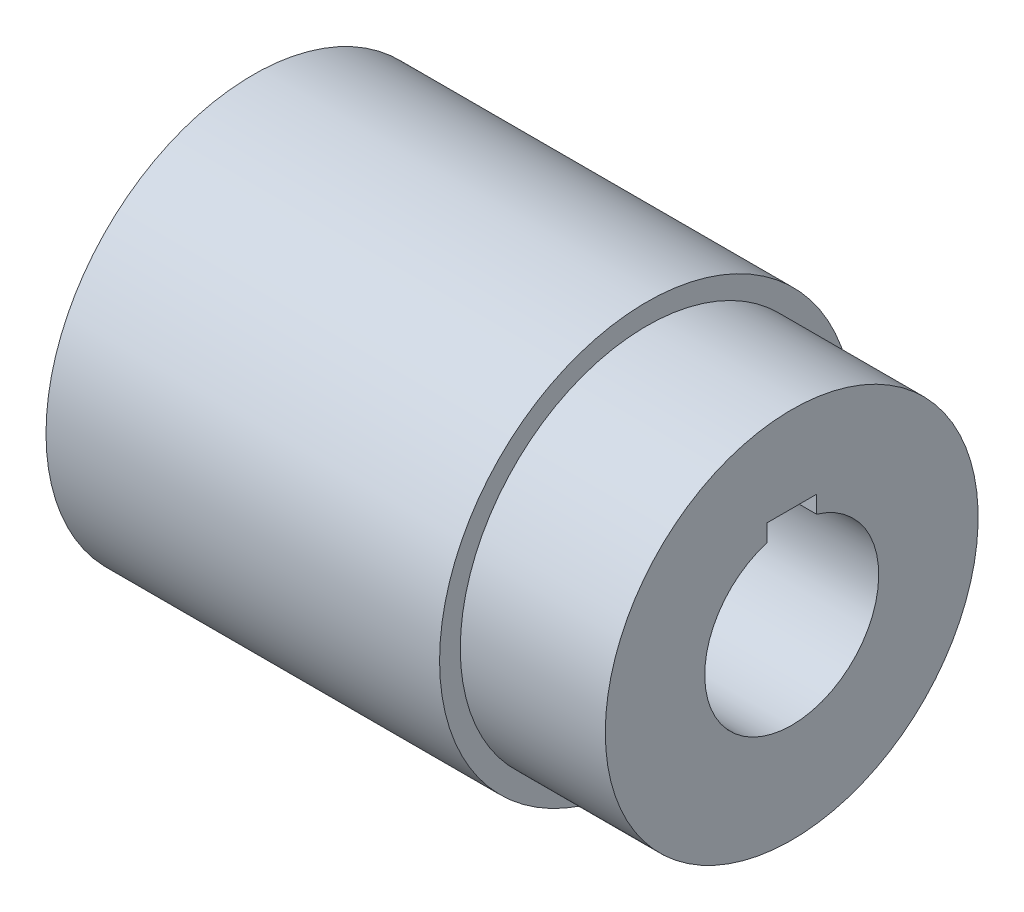
ISO-10303-21;
HEADER;
FILE_DESCRIPTION(('STEP AP214'),'2;1');
FILE_NAME('part.step','',(''),(''),'','','');
FILE_SCHEMA(('AUTOMOTIVE_DESIGN { 1 0 10303 214 1 1 1 1 }'));
ENDSEC;
DATA;
#1=APPLICATION_CONTEXT('core data for automotive mechanical design processes');
#2=APPLICATION_PROTOCOL_DEFINITION('international standard','automotive_design',2000,#1);
#3=PRODUCT_CONTEXT('',#1,'mechanical');
#4=PRODUCT('Part','Part','',(#3));
#5=PRODUCT_RELATED_PRODUCT_CATEGORY('part','',(#4));
#6=PRODUCT_DEFINITION_FORMATION('','',#4);
#7=PRODUCT_DEFINITION_CONTEXT('part definition',#1,'design');
#8=PRODUCT_DEFINITION('design','',#6,#7);
#9=PRODUCT_DEFINITION_SHAPE('','',#8);
#10=(LENGTH_UNIT() NAMED_UNIT(*) SI_UNIT(.MILLI.,.METRE.));
#11=(NAMED_UNIT(*) PLANE_ANGLE_UNIT() SI_UNIT($,.RADIAN.));
#12=(NAMED_UNIT(*) SI_UNIT($,.STERADIAN.) SOLID_ANGLE_UNIT());
#13=UNCERTAINTY_MEASURE_WITH_UNIT(LENGTH_MEASURE(1.E-05),#10,'distance_accuracy_value','');
#14=(GEOMETRIC_REPRESENTATION_CONTEXT(3) GLOBAL_UNCERTAINTY_ASSIGNED_CONTEXT((#13)) GLOBAL_UNIT_ASSIGNED_CONTEXT((#10,
#11,#12)) REPRESENTATION_CONTEXT('',''));
#15=CARTESIAN_POINT('',(0.,0.,0.));
#16=DIRECTION('',(0.,0.,1.));
#17=DIRECTION('',(1.,0.,0.));
#18=AXIS2_PLACEMENT_3D('',#15,#16,#17);
#19=CARTESIAN_POINT('',(130.,0.,0.));
#20=DIRECTION('',(-1.,0.,0.));
#21=DIRECTION('',(0.,0.,1.));
#22=AXIS2_PLACEMENT_3D('',#19,#20,#21);
#23=CYLINDRICAL_SURFACE('',#22,21.);
#24=DIRECTION('',(-1.,0.,0.));
#25=VECTOR('',#24,1.);
#26=CARTESIAN_POINT('',(130.,20.1246117974981,-5.99999999999999));
#27=LINE('',#26,#25);
#28=CARTESIAN_POINT('',(20.,20.1246117974981,-5.99999999999999));
#29=VERTEX_POINT('',#28);
#30=CARTESIAN_POINT('',(130.,20.1246117974981,-5.99999999999999));
#31=VERTEX_POINT('',#30);
#32=EDGE_CURVE('E60',#29,#31,#27,.F.);
#33=ORIENTED_EDGE('',*,*,#32,.F.);
#34=CARTESIAN_POINT('',(20.,0.,0.));
#35=DIRECTION('',(-1.,0.,0.));
#36=DIRECTION('',(0.,0.,1.));
#37=AXIS2_PLACEMENT_3D('',#34,#35,#36);
#38=CIRCLE('',#37,21.);
#39=CARTESIAN_POINT('',(20.,20.1246117974981,6.00000000000001));
#40=VERTEX_POINT('',#39);
#41=EDGE_CURVE('E53',#29,#40,#38,.T.);
#42=ORIENTED_EDGE('',*,*,#41,.T.);
#43=DIRECTION('',(-1.,0.,0.));
#44=VECTOR('',#43,1.);
#45=CARTESIAN_POINT('',(130.,20.1246117974981,6.00000000000001));
#46=LINE('',#45,#44);
#47=CARTESIAN_POINT('',(130.,20.1246117974981,6.00000000000001));
#48=VERTEX_POINT('',#47);
#49=EDGE_CURVE('E47',#48,#40,#46,.T.);
#50=ORIENTED_EDGE('',*,*,#49,.F.);
#51=CARTESIAN_POINT('',(130.,0.,0.));
#52=DIRECTION('',(1.,0.,0.));
#53=DIRECTION('',(0.,0.,-1.));
#54=AXIS2_PLACEMENT_3D('',#51,#52,#53);
#55=CIRCLE('',#54,21.);
#56=EDGE_CURVE('E142',#48,#31,#55,.T.);
#57=ORIENTED_EDGE('',*,*,#56,.T.);
#58=EDGE_LOOP('',(#33,#42,#50,#57));
#59=FACE_BOUND('',#58,.T.);
#60=ADVANCED_FACE('F39',(#59),#23,.F.);
#61=CARTESIAN_POINT('',(130.,24.3,-5.99999999999999));
#62=DIRECTION('',(0.,1.,0.));
#63=DIRECTION('',(0.,0.,1.));
#64=AXIS2_PLACEMENT_3D('',#61,#62,#63);
#65=PLANE('',#64);
#66=DIRECTION('',(0.,0.,1.));
#67=VECTOR('',#66,1.);
#68=CARTESIAN_POINT('',(20.,24.3,-5.99999999999999));
#69=LINE('',#68,#67);
#70=CARTESIAN_POINT('',(20.,24.3,-5.99999999999999));
#71=VERTEX_POINT('',#70);
#72=CARTESIAN_POINT('',(20.,24.3,6.00000000000001));
#73=VERTEX_POINT('',#72);
#74=EDGE_CURVE('E114',#71,#73,#69,.T.);
#75=ORIENTED_EDGE('',*,*,#74,.F.);
#76=DIRECTION('',(-1.,0.,0.));
#77=VECTOR('',#76,1.);
#78=CARTESIAN_POINT('',(130.,24.3,-5.99999999999999));
#79=LINE('',#78,#77);
#80=CARTESIAN_POINT('',(130.,24.3,-5.99999999999999));
#81=VERTEX_POINT('',#80);
#82=EDGE_CURVE('E139',#81,#71,#79,.T.);
#83=ORIENTED_EDGE('',*,*,#82,.F.);
#84=DIRECTION('',(0.,0.,-1.));
#85=VECTOR('',#84,1.);
#86=CARTESIAN_POINT('',(130.,24.3,-5.99999999999999));
#87=LINE('',#86,#85);
#88=CARTESIAN_POINT('',(130.,24.3,6.00000000000001));
#89=VERTEX_POINT('',#88);
#90=EDGE_CURVE('E133',#89,#81,#87,.T.);
#91=ORIENTED_EDGE('',*,*,#90,.F.);
#92=DIRECTION('',(-1.,0.,0.));
#93=VECTOR('',#92,1.);
#94=CARTESIAN_POINT('',(130.,24.3,6.00000000000001));
#95=LINE('',#94,#93);
#96=EDGE_CURVE('E138',#89,#73,#95,.T.);
#97=ORIENTED_EDGE('',*,*,#96,.T.);
#98=EDGE_LOOP('',(#75,#83,#91,#97));
#99=FACE_BOUND('',#98,.T.);
#100=ADVANCED_FACE('F163',(#99),#65,.F.);
#101=CARTESIAN_POINT('',(130.,17.7,6.00000000000001));
#102=DIRECTION('',(0.,0.,1.));
#103=DIRECTION('',(1.,0.,0.));
#104=AXIS2_PLACEMENT_3D('',#101,#102,#103);
#105=PLANE('',#104);
#106=DIRECTION('',(0.,-1.,0.));
#107=VECTOR('',#106,1.);
#108=CARTESIAN_POINT('',(20.,17.7,6.00000000000001));
#109=LINE('',#108,#107);
#110=EDGE_CURVE('E119',#73,#40,#109,.T.);
#111=ORIENTED_EDGE('',*,*,#110,.F.);
#112=ORIENTED_EDGE('',*,*,#96,.F.);
#113=DIRECTION('',(0.,1.,0.));
#114=VECTOR('',#113,1.);
#115=CARTESIAN_POINT('',(130.,17.7,6.00000000000001));
#116=LINE('',#115,#114);
#117=EDGE_CURVE('E130',#48,#89,#116,.T.);
#118=ORIENTED_EDGE('',*,*,#117,.F.);
#119=ORIENTED_EDGE('',*,*,#49,.T.);
#120=EDGE_LOOP('',(#111,#112,#118,#119));
#121=FACE_BOUND('',#120,.T.);
#122=ADVANCED_FACE('F154',(#121),#105,.F.);
#123=CARTESIAN_POINT('',(130.,17.7,-5.99999999999999));
#124=DIRECTION('',(0.,0.,-1.));
#125=DIRECTION('',(-1.,0.,0.));
#126=AXIS2_PLACEMENT_3D('',#123,#124,#125);
#127=PLANE('',#126);
#128=DIRECTION('',(0.,1.,0.));
#129=VECTOR('',#128,1.);
#130=CARTESIAN_POINT('',(20.,17.7,-5.99999999999999));
#131=LINE('',#130,#129);
#132=EDGE_CURVE('E11',#29,#71,#131,.T.);
#133=ORIENTED_EDGE('',*,*,#132,.F.);
#134=ORIENTED_EDGE('',*,*,#32,.T.);
#135=DIRECTION('',(0.,-1.,0.));
#136=VECTOR('',#135,1.);
#137=CARTESIAN_POINT('',(130.,17.7,-5.99999999999999));
#138=LINE('',#137,#136);
#139=EDGE_CURVE('E136',#81,#31,#138,.T.);
#140=ORIENTED_EDGE('',*,*,#139,.F.);
#141=ORIENTED_EDGE('',*,*,#82,.T.);
#142=EDGE_LOOP('',(#133,#134,#140,#141));
#143=FACE_BOUND('',#142,.T.);
#144=ADVANCED_FACE('F160',(#143),#127,.F.);
#145=CARTESIAN_POINT('',(130.,0.,0.));
#146=DIRECTION('',(-1.,0.,0.));
#147=DIRECTION('',(0.,0.,1.));
#148=AXIS2_PLACEMENT_3D('',#145,#146,#147);
#149=CYLINDRICAL_SURFACE('',#148,50.);
#150=CARTESIAN_POINT('',(0.,0.,0.));
#151=DIRECTION('',(1.,0.,0.));
#152=DIRECTION('',(0.,0.,-1.));
#153=AXIS2_PLACEMENT_3D('',#150,#151,#152);
#154=CIRCLE('',#153,50.);
#155=CARTESIAN_POINT('',(0.,0.,-50.));
#156=VERTEX_POINT('',#155);
#157=EDGE_CURVE('E147',#156,#156,#154,.T.);
#158=ORIENTED_EDGE('',*,*,#157,.T.);
#159=EDGE_LOOP('',(#158));
#160=FACE_BOUND('',#159,.T.);
#161=CARTESIAN_POINT('',(95.,0.,0.));
#162=DIRECTION('',(-1.,0.,0.));
#163=DIRECTION('',(0.,0.,1.));
#164=AXIS2_PLACEMENT_3D('',#161,#162,#163);
#165=CIRCLE('',#164,50.);
#166=CARTESIAN_POINT('',(95.,0.,50.));
#167=VERTEX_POINT('',#166);
#168=EDGE_CURVE('E121',#167,#167,#165,.T.);
#169=ORIENTED_EDGE('',*,*,#168,.T.);
#170=EDGE_LOOP('',(#169));
#171=FACE_BOUND('',#170,.T.);
#172=ADVANCED_FACE('F41',(#160,#171),#149,.T.);
#173=CARTESIAN_POINT('',(130.,0.,0.));
#174=DIRECTION('',(1.,0.,0.));
#175=DIRECTION('',(0.,0.,-1.));
#176=AXIS2_PLACEMENT_3D('',#173,#174,#175);
#177=PLANE('',#176);
#178=CARTESIAN_POINT('',(130.,0.,0.));
#179=DIRECTION('',(-1.,0.,0.));
#180=DIRECTION('',(0.,0.,1.));
#181=AXIS2_PLACEMENT_3D('',#178,#179,#180);
#182=CIRCLE('',#181,45.);
#183=CARTESIAN_POINT('',(130.,0.,45.));
#184=VERTEX_POINT('',#183);
#185=EDGE_CURVE('E127',#184,#184,#182,.T.);
#186=ORIENTED_EDGE('',*,*,#185,.F.);
#187=EDGE_LOOP('',(#186));
#188=FACE_BOUND('',#187,.T.);
#189=ORIENTED_EDGE('',*,*,#117,.T.);
#190=ORIENTED_EDGE('',*,*,#90,.T.);
#191=ORIENTED_EDGE('',*,*,#139,.T.);
#192=ORIENTED_EDGE('',*,*,#56,.F.);
#193=EDGE_LOOP('',(#189,#190,#191,#192));
#194=FACE_BOUND('',#193,.T.);
#195=ADVANCED_FACE('F158',(#188,#194),#177,.T.);
#196=CARTESIAN_POINT('',(0.,0.,0.));
#197=DIRECTION('',(1.,0.,0.));
#198=DIRECTION('',(0.,0.,-1.));
#199=AXIS2_PLACEMENT_3D('',#196,#197,#198);
#200=PLANE('',#199);
#201=CARTESIAN_POINT('',(0.,0.,-42.5));
#202=DIRECTION('',(-1.,0.,0.));
#203=DIRECTION('',(0.,0.,1.));
#204=AXIS2_PLACEMENT_3D('',#201,#202,#203);
#205=CIRCLE('',#204,4.025);
#206=CARTESIAN_POINT('',(0.,0.,-38.475));
#207=VERTEX_POINT('',#206);
#208=EDGE_CURVE('E101',#207,#207,#205,.T.);
#209=ORIENTED_EDGE('',*,*,#208,.F.);
#210=EDGE_LOOP('',(#209));
#211=FACE_BOUND('',#210,.T.);
#212=CARTESIAN_POINT('',(0.,0.,42.5));
#213=DIRECTION('',(-1.,0.,0.));
#214=DIRECTION('',(0.,0.,1.));
#215=AXIS2_PLACEMENT_3D('',#212,#213,#214);
#216=CIRCLE('',#215,4.025);
#217=CARTESIAN_POINT('',(0.,0.,46.525));
#218=VERTEX_POINT('',#217);
#219=EDGE_CURVE('E94',#218,#218,#216,.T.);
#220=ORIENTED_EDGE('',*,*,#219,.F.);
#221=EDGE_LOOP('',(#220));
#222=FACE_BOUND('',#221,.T.);
#223=CARTESIAN_POINT('',(0.,0.,0.));
#224=DIRECTION('',(-1.,0.,0.));
#225=DIRECTION('',(0.,0.,1.));
#226=AXIS2_PLACEMENT_3D('',#223,#224,#225);
#227=CIRCLE('',#226,32.5);
#228=CARTESIAN_POINT('',(0.,0.,32.5));
#229=VERTEX_POINT('',#228);
#230=EDGE_CURVE('E110',#229,#229,#227,.T.);
#231=ORIENTED_EDGE('',*,*,#230,.F.);
#232=EDGE_LOOP('',(#231));
#233=FACE_BOUND('',#232,.T.);
#234=ORIENTED_EDGE('',*,*,#157,.F.);
#235=EDGE_LOOP('',(#234));
#236=FACE_BOUND('',#235,.T.);
#237=ADVANCED_FACE('F190',(#211,#222,#233,#236),#200,.F.);
#238=CARTESIAN_POINT('',(0.,0.,0.));
#239=DIRECTION('',(-1.,0.,0.));
#240=DIRECTION('',(0.,0.,1.));
#241=AXIS2_PLACEMENT_3D('',#238,#239,#240);
#242=CYLINDRICAL_SURFACE('',#241,45.);
#243=CARTESIAN_POINT('',(95.,0.,0.));
#244=DIRECTION('',(-1.,0.,0.));
#245=DIRECTION('',(0.,0.,1.));
#246=AXIS2_PLACEMENT_3D('',#243,#244,#245);
#247=CIRCLE('',#246,45.);
#248=CARTESIAN_POINT('',(95.,0.,45.));
#249=VERTEX_POINT('',#248);
#250=EDGE_CURVE('E124',#249,#249,#247,.T.);
#251=ORIENTED_EDGE('',*,*,#250,.F.);
#252=EDGE_LOOP('',(#251));
#253=FACE_BOUND('',#252,.T.);
#254=ORIENTED_EDGE('',*,*,#185,.T.);
#255=EDGE_LOOP('',(#254));
#256=FACE_BOUND('',#255,.T.);
#257=ADVANCED_FACE('F177',(#253,#256),#242,.T.);
#258=CARTESIAN_POINT('',(95.,0.,50.));
#259=DIRECTION('',(1.,0.,0.));
#260=DIRECTION('',(0.,0.,-1.));
#261=AXIS2_PLACEMENT_3D('',#258,#259,#260);
#262=PLANE('',#261);
#263=ORIENTED_EDGE('',*,*,#250,.T.);
#264=EDGE_LOOP('',(#263));
#265=FACE_BOUND('',#264,.T.);
#266=ORIENTED_EDGE('',*,*,#168,.F.);
#267=EDGE_LOOP('',(#266));
#268=FACE_BOUND('',#267,.T.);
#269=ADVANCED_FACE('F167',(#265,#268),#262,.T.);
#270=CARTESIAN_POINT('',(20.,0.,0.));
#271=DIRECTION('',(-1.,0.,0.));
#272=DIRECTION('',(0.,0.,1.));
#273=AXIS2_PLACEMENT_3D('',#270,#271,#272);
#274=PLANE('',#273);
#275=CARTESIAN_POINT('',(20.,0.,0.));
#276=DIRECTION('',(-1.,0.,0.));
#277=DIRECTION('',(0.,0.,1.));
#278=AXIS2_PLACEMENT_3D('',#275,#276,#277);
#279=CIRCLE('',#278,32.5);
#280=CARTESIAN_POINT('',(20.,0.,32.5));
#281=VERTEX_POINT('',#280);
#282=EDGE_CURVE('E111',#281,#281,#279,.T.);
#283=ORIENTED_EDGE('',*,*,#282,.T.);
#284=EDGE_LOOP('',(#283));
#285=FACE_BOUND('',#284,.T.);
#286=ORIENTED_EDGE('',*,*,#110,.T.);
#287=ORIENTED_EDGE('',*,*,#41,.F.);
#288=ORIENTED_EDGE('',*,*,#132,.T.);
#289=ORIENTED_EDGE('',*,*,#74,.T.);
#290=EDGE_LOOP('',(#286,#287,#288,#289));
#291=FACE_BOUND('',#290,.T.);
#292=ADVANCED_FACE('F164',(#285,#291),#274,.T.);
#293=CARTESIAN_POINT('',(20.,0.,0.));
#294=DIRECTION('',(-1.,0.,0.));
#295=DIRECTION('',(0.,0.,1.));
#296=AXIS2_PLACEMENT_3D('',#293,#294,#295);
#297=CYLINDRICAL_SURFACE('',#296,32.5);
#298=ORIENTED_EDGE('',*,*,#282,.F.);
#299=EDGE_LOOP('',(#298));
#300=FACE_BOUND('',#299,.T.);
#301=ORIENTED_EDGE('',*,*,#230,.T.);
#302=EDGE_LOOP('',(#301));
#303=FACE_BOUND('',#302,.T.);
#304=ADVANCED_FACE('F166',(#300,#303),#297,.F.);
#305=CARTESIAN_POINT('',(40.,0.,42.5));
#306=DIRECTION('',(-1.,0.,0.));
#307=DIRECTION('',(0.,0.,1.));
#308=AXIS2_PLACEMENT_3D('',#305,#306,#307);
#309=CONICAL_SURFACE('',#308,3.49999999999999,1.02974425867665);
#310=CARTESIAN_POINT('',(42.1030121665965,0.,42.5));
#311=VERTEX_POINT('',#310);
#312=VERTEX_LOOP('',#311);
#313=FACE_BOUND('',#312,.T.);
#314=CARTESIAN_POINT('',(40.,0.,42.5));
#315=DIRECTION('',(-1.,0.,0.));
#316=DIRECTION('',(0.,0.,1.));
#317=AXIS2_PLACEMENT_3D('',#314,#315,#316);
#318=CIRCLE('',#317,3.49999999999999);
#319=CARTESIAN_POINT('',(40.,0.,46.));
#320=VERTEX_POINT('',#319);
#321=EDGE_CURVE('E107',#320,#320,#318,.T.);
#322=ORIENTED_EDGE('',*,*,#321,.T.);
#323=EDGE_LOOP('',(#322));
#324=FACE_BOUND('',#323,.T.);
#325=ADVANCED_FACE('F174',(#313,#324),#309,.F.);
#326=CARTESIAN_POINT('',(0.,0.,42.5));
#327=DIRECTION('',(-1.,0.,0.));
#328=DIRECTION('',(0.,0.,1.));
#329=AXIS2_PLACEMENT_3D('',#326,#327,#328);
#330=CYLINDRICAL_SURFACE('',#329,3.49999999999999);
#331=ORIENTED_EDGE('',*,*,#321,.F.);
#332=EDGE_LOOP('',(#331));
#333=FACE_BOUND('',#332,.T.);
#334=CARTESIAN_POINT('',(0.525000000000005,0.,42.5));
#335=DIRECTION('',(-1.,0.,0.));
#336=DIRECTION('',(0.,0.,1.));
#337=AXIS2_PLACEMENT_3D('',#334,#335,#336);
#338=CIRCLE('',#337,3.49999999999999);
#339=CARTESIAN_POINT('',(0.525000000000005,0.,46.));
#340=VERTEX_POINT('',#339);
#341=EDGE_CURVE('E98',#340,#340,#338,.T.);
#342=ORIENTED_EDGE('',*,*,#341,.T.);
#343=EDGE_LOOP('',(#342));
#344=FACE_BOUND('',#343,.T.);
#345=ADVANCED_FACE('F280',(#333,#344),#330,.F.);
#346=CARTESIAN_POINT('',(0.,0.,42.5));
#347=DIRECTION('',(-1.,0.,0.));
#348=DIRECTION('',(0.,0.,1.));
#349=AXIS2_PLACEMENT_3D('',#346,#347,#348);
#350=CONICAL_SURFACE('',#349,4.025,0.78539816339745);
#351=ORIENTED_EDGE('',*,*,#341,.F.);
#352=EDGE_LOOP('',(#351));
#353=FACE_BOUND('',#352,.T.);
#354=ORIENTED_EDGE('',*,*,#219,.T.);
#355=EDGE_LOOP('',(#354));
#356=FACE_BOUND('',#355,.T.);
#357=ADVANCED_FACE('F88',(#353,#356),#350,.F.);
#358=CARTESIAN_POINT('',(40.,0.,-42.5));
#359=DIRECTION('',(-1.,0.,0.));
#360=DIRECTION('',(0.,0.,1.));
#361=AXIS2_PLACEMENT_3D('',#358,#359,#360);
#362=CONICAL_SURFACE('',#361,3.49999999999999,1.02974425867665);
#363=CARTESIAN_POINT('',(42.1030121665965,0.,-42.5));
#364=VERTEX_POINT('',#363);
#365=VERTEX_LOOP('',#364);
#366=FACE_BOUND('',#365,.T.);
#367=CARTESIAN_POINT('',(40.,0.,-42.5));
#368=DIRECTION('',(-1.,0.,0.));
#369=DIRECTION('',(0.,0.,1.));
#370=AXIS2_PLACEMENT_3D('',#367,#368,#369);
#371=CIRCLE('',#370,3.49999999999999);
#372=CARTESIAN_POINT('',(40.,0.,-39.));
#373=VERTEX_POINT('',#372);
#374=EDGE_CURVE('E92',#373,#373,#371,.T.);
#375=ORIENTED_EDGE('',*,*,#374,.T.);
#376=EDGE_LOOP('',(#375));
#377=FACE_BOUND('',#376,.T.);
#378=ADVANCED_FACE('F84',(#366,#377),#362,.F.);
#379=CARTESIAN_POINT('',(0.,0.,-42.5));
#380=DIRECTION('',(-1.,0.,0.));
#381=DIRECTION('',(0.,0.,1.));
#382=AXIS2_PLACEMENT_3D('',#379,#380,#381);
#383=CYLINDRICAL_SURFACE('',#382,3.49999999999999);
#384=ORIENTED_EDGE('',*,*,#374,.F.);
#385=EDGE_LOOP('',(#384));
#386=FACE_BOUND('',#385,.T.);
#387=CARTESIAN_POINT('',(0.525000000000005,0.,-42.5));
#388=DIRECTION('',(-1.,0.,0.));
#389=DIRECTION('',(0.,0.,1.));
#390=AXIS2_PLACEMENT_3D('',#387,#388,#389);
#391=CIRCLE('',#390,3.49999999999999);
#392=CARTESIAN_POINT('',(0.525000000000005,0.,-39.));
#393=VERTEX_POINT('',#392);
#394=EDGE_CURVE('E95',#393,#393,#391,.T.);
#395=ORIENTED_EDGE('',*,*,#394,.T.);
#396=EDGE_LOOP('',(#395));
#397=FACE_BOUND('',#396,.T.);
#398=ADVANCED_FACE('F87',(#386,#397),#383,.F.);
#399=CARTESIAN_POINT('',(0.,0.,-42.5));
#400=DIRECTION('',(-1.,0.,0.));
#401=DIRECTION('',(0.,0.,1.));
#402=AXIS2_PLACEMENT_3D('',#399,#400,#401);
#403=CONICAL_SURFACE('',#402,4.025,0.78539816339745);
#404=ORIENTED_EDGE('',*,*,#394,.F.);
#405=EDGE_LOOP('',(#404));
#406=FACE_BOUND('',#405,.T.);
#407=ORIENTED_EDGE('',*,*,#208,.T.);
#408=EDGE_LOOP('',(#407));
#409=FACE_BOUND('',#408,.T.);
#410=ADVANCED_FACE('F306',(#406,#409),#403,.F.);
#411=CLOSED_SHELL('',(#60,#100,#122,#144,#172,#195,#237,#257,#269,#292,#304,#325,#345,#357,#378,
#398,#410));
#412=MANIFOLD_SOLID_BREP('B2',#411);
#413=ADVANCED_BREP_SHAPE_REPRESENTATION('',(#18,#412),#14);
#414=SHAPE_DEFINITION_REPRESENTATION(#9,#413);
ENDSEC;
END-ISO-10303-21;
